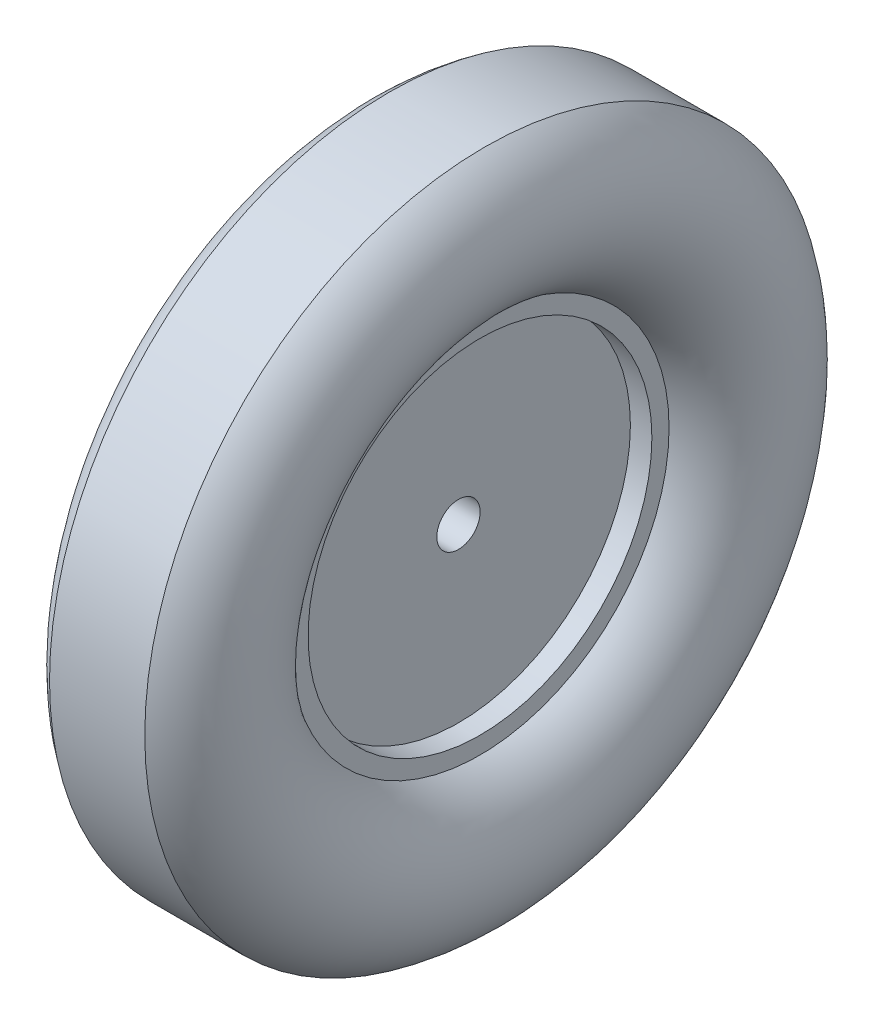
ISO-10303-21;
HEADER;
FILE_DESCRIPTION(('STEP AP214'),'2;1');
FILE_NAME('part.step','',(''),(''),'','','');
FILE_SCHEMA(('AUTOMOTIVE_DESIGN { 1 0 10303 214 1 1 1 1 }'));
ENDSEC;
DATA;
#1=APPLICATION_CONTEXT('core data for automotive mechanical design processes');
#2=APPLICATION_PROTOCOL_DEFINITION('international standard','automotive_design',2000,#1);
#3=PRODUCT_CONTEXT('',#1,'mechanical');
#4=PRODUCT('Part','Part','',(#3));
#5=PRODUCT_RELATED_PRODUCT_CATEGORY('part','',(#4));
#6=PRODUCT_DEFINITION_FORMATION('','',#4);
#7=PRODUCT_DEFINITION_CONTEXT('part definition',#1,'design');
#8=PRODUCT_DEFINITION('design','',#6,#7);
#9=PRODUCT_DEFINITION_SHAPE('','',#8);
#10=(LENGTH_UNIT() NAMED_UNIT(*) SI_UNIT(.MILLI.,.METRE.));
#11=(NAMED_UNIT(*) PLANE_ANGLE_UNIT() SI_UNIT($,.RADIAN.));
#12=(NAMED_UNIT(*) SI_UNIT($,.STERADIAN.) SOLID_ANGLE_UNIT());
#13=UNCERTAINTY_MEASURE_WITH_UNIT(LENGTH_MEASURE(1.E-05),#10,'distance_accuracy_value','');
#14=(GEOMETRIC_REPRESENTATION_CONTEXT(3) GLOBAL_UNCERTAINTY_ASSIGNED_CONTEXT((#13)) GLOBAL_UNIT_ASSIGNED_CONTEXT((#10,
#11,#12)) REPRESENTATION_CONTEXT('',''));
#15=CARTESIAN_POINT('',(0.,0.,0.));
#16=DIRECTION('',(0.,0.,1.));
#17=DIRECTION('',(1.,0.,0.));
#18=AXIS2_PLACEMENT_3D('',#15,#16,#17);
#19=CARTESIAN_POINT('',(19.0502811206523,0.,0.));
#20=DIRECTION('',(1.,0.,0.));
#21=DIRECTION('',(0.,0.,-1.));
#22=AXIS2_PLACEMENT_3D('',#19,#20,#21);
#23=CYLINDRICAL_SURFACE('',#22,19.20753394509);
#24=CARTESIAN_POINT('',(-19.0497188793477,0.,0.));
#25=DIRECTION('',(1.,0.,0.));
#26=DIRECTION('',(0.,0.,-1.));
#27=AXIS2_PLACEMENT_3D('',#24,#25,#26);
#28=CIRCLE('',#27,19.20753394509);
#29=CARTESIAN_POINT('',(-19.0497188793477,0.,-19.20753394509));
#30=VERTEX_POINT('',#29);
#31=EDGE_CURVE('E72',#30,#30,#28,.T.);
#32=ORIENTED_EDGE('',*,*,#31,.F.);
#33=EDGE_LOOP('',(#32));
#34=FACE_BOUND('',#33,.T.);
#35=CARTESIAN_POINT('',(19.0502811206523,0.,0.));
#36=DIRECTION('',(1.,0.,0.));
#37=DIRECTION('',(0.,0.,-1.));
#38=AXIS2_PLACEMENT_3D('',#35,#36,#37);
#39=CIRCLE('',#38,19.20753394509);
#40=CARTESIAN_POINT('',(19.0502811206523,0.,-19.20753394509));
#41=VERTEX_POINT('',#40);
#42=EDGE_CURVE('E10',#41,#41,#39,.T.);
#43=ORIENTED_EDGE('',*,*,#42,.T.);
#44=EDGE_LOOP('',(#43));
#45=FACE_BOUND('',#44,.T.);
#46=ADVANCED_FACE('F38',(#34,#45),#23,.F.);
#47=CARTESIAN_POINT('',(19.0502811206523,0.,0.));
#48=DIRECTION('',(1.,0.,0.));
#49=DIRECTION('',(0.,0.,-1.));
#50=AXIS2_PLACEMENT_3D('',#47,#48,#49);
#51=PLANE('',#50);
#52=CARTESIAN_POINT('',(19.0502811206523,0.,0.));
#53=DIRECTION('',(1.,0.,0.));
#54=DIRECTION('',(0.,0.,-1.));
#55=AXIS2_PLACEMENT_3D('',#52,#53,#54);
#56=CIRCLE('',#55,152.4);
#57=CARTESIAN_POINT('',(19.0502811206523,0.,-152.4));
#58=VERTEX_POINT('',#57);
#59=EDGE_CURVE('E44',#58,#58,#56,.T.);
#60=ORIENTED_EDGE('',*,*,#59,.T.);
#61=EDGE_LOOP('',(#60));
#62=FACE_BOUND('',#61,.T.);
#63=ORIENTED_EDGE('',*,*,#42,.F.);
#64=EDGE_LOOP('',(#63));
#65=FACE_BOUND('',#64,.T.);
#66=ADVANCED_FACE('F79',(#62,#65),#51,.T.);
#67=CARTESIAN_POINT('',(19.0502811206523,0.,0.));
#68=DIRECTION('',(1.,0.,0.));
#69=DIRECTION('',(0.,0.,-1.));
#70=AXIS2_PLACEMENT_3D('',#67,#68,#69);
#71=CYLINDRICAL_SURFACE('',#70,152.4);
#72=CARTESIAN_POINT('',(38.0993541113206,0.,0.));
#73=DIRECTION('',(1.,0.,0.));
#74=DIRECTION('',(0.,0.,-1.));
#75=AXIS2_PLACEMENT_3D('',#72,#73,#74);
#76=CIRCLE('',#75,152.4);
#77=CARTESIAN_POINT('',(38.0993541113206,0.,-152.4));
#78=VERTEX_POINT('',#77);
#79=EDGE_CURVE('E48',#78,#78,#76,.T.);
#80=ORIENTED_EDGE('',*,*,#79,.T.);
#81=EDGE_LOOP('',(#80));
#82=FACE_BOUND('',#81,.T.);
#83=ORIENTED_EDGE('',*,*,#59,.F.);
#84=EDGE_LOOP('',(#83));
#85=FACE_BOUND('',#84,.T.);
#86=ADVANCED_FACE('F83',(#82,#85),#71,.F.);
#87=CARTESIAN_POINT('',(38.0993541113206,0.,0.));
#88=DIRECTION('',(1.,0.,0.));
#89=DIRECTION('',(0.,0.,-1.));
#90=AXIS2_PLACEMENT_3D('',#87,#88,#89);
#91=PLANE('',#90);
#92=CARTESIAN_POINT('',(38.0993541113206,0.,0.));
#93=DIRECTION('',(1.,0.,0.));
#94=DIRECTION('',(0.,0.,-1.));
#95=AXIS2_PLACEMENT_3D('',#92,#93,#94);
#96=CIRCLE('',#95,167.64);
#97=CARTESIAN_POINT('',(38.0993541113206,0.,-167.64));
#98=VERTEX_POINT('',#97);
#99=EDGE_CURVE('E52',#98,#98,#96,.T.);
#100=ORIENTED_EDGE('',*,*,#99,.T.);
#101=EDGE_LOOP('',(#100));
#102=FACE_BOUND('',#101,.T.);
#103=ORIENTED_EDGE('',*,*,#79,.F.);
#104=EDGE_LOOP('',(#103));
#105=FACE_BOUND('',#104,.T.);
#106=ADVANCED_FACE('F87',(#102,#105),#91,.T.);
#107=CARTESIAN_POINT('',(-0.000645888679381515,0.,0.));
#108=DIRECTION('',(1.,0.,0.));
#109=DIRECTION('',(0.,0.,-1.));
#110=AXIS2_PLACEMENT_3D('',#107,#108,#109);
#111=TOROIDAL_SURFACE('',#110,235.707759481256,78.0053195673094);
#112=ORIENTED_EDGE('',*,*,#99,.F.);
#113=EDGE_LOOP('',(#112));
#114=FACE_BOUND('',#113,.T.);
#115=CARTESIAN_POINT('',(42.2272229480648,0.,0.));
#116=DIRECTION('',(1.,0.,0.));
#117=DIRECTION('',(0.,0.,-1.));
#118=AXIS2_PLACEMENT_3D('',#115,#116,#117);
#119=CIRCLE('',#118,301.294625348629);
#120=CARTESIAN_POINT('',(42.2272229480648,0.,-301.294625348629));
#121=VERTEX_POINT('',#120);
#122=EDGE_CURVE('E57',#121,#121,#119,.T.);
#123=ORIENTED_EDGE('',*,*,#122,.T.);
#124=EDGE_LOOP('',(#123));
#125=FACE_BOUND('',#124,.T.);
#126=ADVANCED_FACE('F94',(#114,#125),#111,.T.);
#127=CARTESIAN_POINT('',(19.0502811206523,0.,0.));
#128=DIRECTION('',(1.,0.,0.));
#129=DIRECTION('',(0.,0.,-1.));
#130=AXIS2_PLACEMENT_3D('',#127,#128,#129);
#131=CYLINDRICAL_SURFACE('',#130,301.294625348629);
#132=CARTESIAN_POINT('',(-42.2285147254236,0.,0.));
#133=DIRECTION('',(1.,0.,0.));
#134=DIRECTION('',(0.,0.,-1.));
#135=AXIS2_PLACEMENT_3D('',#132,#133,#134);
#136=CIRCLE('',#135,301.294625348629);
#137=CARTESIAN_POINT('',(-42.2285147254236,0.,-301.294625348629));
#138=VERTEX_POINT('',#137);
#139=EDGE_CURVE('E60',#138,#138,#136,.T.);
#140=ORIENTED_EDGE('',*,*,#139,.T.);
#141=EDGE_LOOP('',(#140));
#142=FACE_BOUND('',#141,.T.);
#143=ORIENTED_EDGE('',*,*,#122,.F.);
#144=EDGE_LOOP('',(#143));
#145=FACE_BOUND('',#144,.T.);
#146=ADVANCED_FACE('F96',(#142,#145),#131,.T.);
#147=ORIENTED_EDGE('',*,*,#139,.F.);
#148=EDGE_LOOP('',(#147));
#149=FACE_BOUND('',#148,.T.);
#150=CARTESIAN_POINT('',(-38.1006458886794,0.,0.));
#151=DIRECTION('',(1.,0.,0.));
#152=DIRECTION('',(0.,0.,-1.));
#153=AXIS2_PLACEMENT_3D('',#150,#151,#152);
#154=CIRCLE('',#153,167.64);
#155=CARTESIAN_POINT('',(-38.1006458886794,0.,-167.64));
#156=VERTEX_POINT('',#155);
#157=EDGE_CURVE('E63',#156,#156,#154,.T.);
#158=ORIENTED_EDGE('',*,*,#157,.T.);
#159=EDGE_LOOP('',(#158));
#160=FACE_BOUND('',#159,.T.);
#161=ADVANCED_FACE('F99',(#149,#160),#111,.T.);
#162=CARTESIAN_POINT('',(-38.1006458886794,0.,0.));
#163=DIRECTION('',(-1.,0.,0.));
#164=DIRECTION('',(0.,0.,1.));
#165=AXIS2_PLACEMENT_3D('',#162,#163,#164);
#166=PLANE('',#165);
#167=CARTESIAN_POINT('',(-38.1006458886794,0.,0.));
#168=DIRECTION('',(1.,0.,0.));
#169=DIRECTION('',(0.,0.,-1.));
#170=AXIS2_PLACEMENT_3D('',#167,#168,#169);
#171=CIRCLE('',#170,152.4);
#172=CARTESIAN_POINT('',(-38.1006458886794,0.,-152.4));
#173=VERTEX_POINT('',#172);
#174=EDGE_CURVE('E66',#173,#173,#171,.T.);
#175=ORIENTED_EDGE('',*,*,#174,.T.);
#176=EDGE_LOOP('',(#175));
#177=FACE_BOUND('',#176,.T.);
#178=ORIENTED_EDGE('',*,*,#157,.F.);
#179=EDGE_LOOP('',(#178));
#180=FACE_BOUND('',#179,.T.);
#181=ADVANCED_FACE('F103',(#177,#180),#166,.T.);
#182=CARTESIAN_POINT('',(19.0502811206523,0.,0.));
#183=DIRECTION('',(1.,0.,0.));
#184=DIRECTION('',(0.,0.,-1.));
#185=AXIS2_PLACEMENT_3D('',#182,#183,#184);
#186=CYLINDRICAL_SURFACE('',#185,152.4);
#187=CARTESIAN_POINT('',(-19.0497188793477,0.,0.));
#188=DIRECTION('',(1.,0.,0.));
#189=DIRECTION('',(0.,0.,-1.));
#190=AXIS2_PLACEMENT_3D('',#187,#188,#189);
#191=CIRCLE('',#190,152.4);
#192=CARTESIAN_POINT('',(-19.0497188793477,0.,-152.4));
#193=VERTEX_POINT('',#192);
#194=EDGE_CURVE('E69',#193,#193,#191,.T.);
#195=ORIENTED_EDGE('',*,*,#194,.T.);
#196=EDGE_LOOP('',(#195));
#197=FACE_BOUND('',#196,.T.);
#198=ORIENTED_EDGE('',*,*,#174,.F.);
#199=EDGE_LOOP('',(#198));
#200=FACE_BOUND('',#199,.T.);
#201=ADVANCED_FACE('F107',(#197,#200),#186,.F.);
#202=CARTESIAN_POINT('',(-19.0497188793477,0.,0.));
#203=DIRECTION('',(1.,0.,0.));
#204=DIRECTION('',(0.,0.,-1.));
#205=AXIS2_PLACEMENT_3D('',#202,#203,#204);
#206=PLANE('',#205);
#207=ORIENTED_EDGE('',*,*,#194,.F.);
#208=EDGE_LOOP('',(#207));
#209=FACE_BOUND('',#208,.T.);
#210=ORIENTED_EDGE('',*,*,#31,.T.);
#211=EDGE_LOOP('',(#210));
#212=FACE_BOUND('',#211,.T.);
#213=ADVANCED_FACE('F76',(#209,#212),#206,.F.);
#214=CLOSED_SHELL('',(#46,#66,#86,#106,#126,#146,#161,#181,#201,#213));
#215=MANIFOLD_SOLID_BREP('B2',#214);
#216=ADVANCED_BREP_SHAPE_REPRESENTATION('',(#18,#215),#14);
#217=SHAPE_DEFINITION_REPRESENTATION(#9,#216);
ENDSEC;
END-ISO-10303-21;
